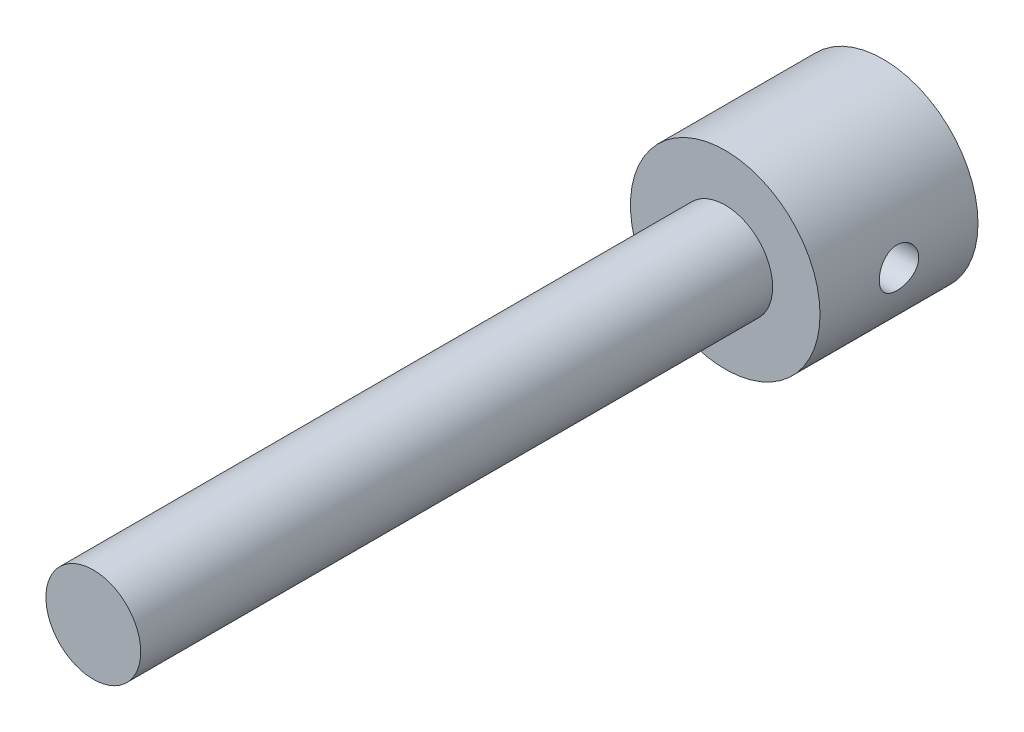
ISO-10303-21;
HEADER;
FILE_DESCRIPTION(('STEP AP214'),'2;1');
FILE_NAME('part.step','',(''),(''),'','','');
FILE_SCHEMA(('AUTOMOTIVE_DESIGN { 1 0 10303 214 1 1 1 1 }'));
ENDSEC;
DATA;
#1=APPLICATION_CONTEXT('core data for automotive mechanical design processes');
#2=APPLICATION_PROTOCOL_DEFINITION('international standard','automotive_design',2000,#1);
#3=PRODUCT_CONTEXT('',#1,'mechanical');
#4=PRODUCT('Part','Part','',(#3));
#5=PRODUCT_RELATED_PRODUCT_CATEGORY('part','',(#4));
#6=PRODUCT_DEFINITION_FORMATION('','',#4);
#7=PRODUCT_DEFINITION_CONTEXT('part definition',#1,'design');
#8=PRODUCT_DEFINITION('design','',#6,#7);
#9=PRODUCT_DEFINITION_SHAPE('','',#8);
#10=(LENGTH_UNIT() NAMED_UNIT(*) SI_UNIT(.MILLI.,.METRE.));
#11=(NAMED_UNIT(*) PLANE_ANGLE_UNIT() SI_UNIT($,.RADIAN.));
#12=(NAMED_UNIT(*) SI_UNIT($,.STERADIAN.) SOLID_ANGLE_UNIT());
#13=UNCERTAINTY_MEASURE_WITH_UNIT(LENGTH_MEASURE(1.E-05),#10,'distance_accuracy_value','');
#14=(GEOMETRIC_REPRESENTATION_CONTEXT(3) GLOBAL_UNCERTAINTY_ASSIGNED_CONTEXT((#13)) GLOBAL_UNIT_ASSIGNED_CONTEXT((#10,
#11,#12)) REPRESENTATION_CONTEXT('',''));
#15=CARTESIAN_POINT('',(0.,0.,0.));
#16=DIRECTION('',(0.,0.,1.));
#17=DIRECTION('',(1.,0.,0.));
#18=AXIS2_PLACEMENT_3D('',#15,#16,#17);
#19=CARTESIAN_POINT('',(0.,0.,20.));
#20=DIRECTION('',(0.,0.,-1.));
#21=DIRECTION('',(-1.,0.,0.));
#22=AXIS2_PLACEMENT_3D('',#19,#20,#21);
#23=CYLINDRICAL_SURFACE('',#22,12.);
#24=CARTESIAN_POINT('',(-12.,0.,12.5));
#25=CARTESIAN_POINT('',(-11.999997430533,-0.138818083403321,12.4999950450616));
#26=CARTESIAN_POINT('',(-11.9975665755009,-0.277697579041751,12.4883986685625));
#27=CARTESIAN_POINT('',(-11.9881040198136,-0.551522632533986,12.4423613009343));
#28=CARTESIAN_POINT('',(-11.981068823785,-0.686465120256625,12.4079029539261));
#29=CARTESIAN_POINT('',(-11.963182183924,-0.948418264582684,12.3172590901564));
#30=CARTESIAN_POINT('',(-11.9523345410529,-1.07543667341837,12.2610952080022));
#31=CARTESIAN_POINT('',(-11.9279985561972,-1.31824065721192,12.1287007822876));
#32=CARTESIAN_POINT('',(-11.9145103325195,-1.43402673506865,12.0524711376883));
#33=CARTESIAN_POINT('',(-11.886154000493,-1.65278064861767,11.8809273196187));
#34=CARTESIAN_POINT('',(-11.8712701169706,-1.75556048832537,11.7853759975298));
#35=CARTESIAN_POINT('',(-11.841913153849,-1.94375555353879,11.5784106816098));
#36=CARTESIAN_POINT('',(-11.8274401083337,-2.02916934192198,11.4669953762555));
#37=CARTESIAN_POINT('',(-11.8003888519062,-2.18102063354434,11.2300960624677));
#38=CARTESIAN_POINT('',(-11.7878309034966,-2.24726109361302,11.1044832309945));
#39=CARTESIAN_POINT('',(-11.7662568130004,-2.35762238696128,10.8436050964545));
#40=CARTESIAN_POINT('',(-11.7572402893514,-2.40174560335283,10.7083408351149));
#41=CARTESIAN_POINT('',(-11.7439300197224,-2.46600480267474,10.4340295251687));
#42=CARTESIAN_POINT('',(-11.7395711371173,-2.48647195393598,10.2950632813305));
#43=CARTESIAN_POINT('',(-11.7358738143298,-2.50386715311229,10.0156063142747));
#44=CARTESIAN_POINT('',(-11.7365348160196,-2.50079781789374,9.87511576226941));
#45=CARTESIAN_POINT('',(-11.7427434863835,-2.47147438074394,9.59903794404965));
#46=CARTESIAN_POINT('',(-11.748210673598,-2.44560210465441,9.46340804067757));
#47=CARTESIAN_POINT('',(-11.7632887523188,-2.3720108705989,9.19845698071014));
#48=CARTESIAN_POINT('',(-11.7728998568263,-2.32429078962764,9.06913614878733));
#49=CARTESIAN_POINT('',(-11.795263829282,-2.20800006427857,8.81938554316804));
#50=CARTESIAN_POINT('',(-11.8080390757117,-2.13928005068474,8.69902740694585));
#51=CARTESIAN_POINT('',(-11.8352778002144,-1.98304539854964,8.47140851146368));
#52=CARTESIAN_POINT('',(-11.8497414879707,-1.89552842452518,8.36414938232805));
#53=CARTESIAN_POINT('',(-11.8790746185982,-1.70214984309357,8.16357207783926));
#54=CARTESIAN_POINT('',(-11.8939464639895,-1.59596286682417,8.07056766220597));
#55=CARTESIAN_POINT('',(-11.92216176286,-1.3693345772236,7.90363911554205));
#56=CARTESIAN_POINT('',(-11.9355051934047,-1.24889305005153,7.82971527080321));
#57=CARTESIAN_POINT('',(-11.9591974188563,-0.996811082470957,7.70297983692809));
#58=CARTESIAN_POINT('',(-11.9695407942052,-0.865150923853,7.65020639086576));
#59=CARTESIAN_POINT('',(-11.9860267642256,-0.59456924194431,7.56761659032901));
#60=CARTESIAN_POINT('',(-11.9921699119211,-0.455648677190179,7.5377972135372));
#61=CARTESIAN_POINT('',(-11.9994855043091,-0.17718373140167,7.50241149586423));
#62=CARTESIAN_POINT('',(-12.0007458707516,-0.0376961110523567,7.4964161170115));
#63=CARTESIAN_POINT('',(-11.9983990450555,0.240287597515429,7.5076898999382));
#64=CARTESIAN_POINT('',(-11.9947921509631,0.378783745924516,7.5249576372032));
#65=CARTESIAN_POINT('',(-11.9831712995837,0.649452734239627,7.58191130693907));
#66=CARTESIAN_POINT('',(-11.9752010573615,0.781674385788413,7.62137497076693));
#67=CARTESIAN_POINT('',(-11.9557445448479,1.03762289332266,7.72135572084282));
#68=CARTESIAN_POINT('',(-11.9442579948916,1.16134907267355,7.78187448173196));
#69=CARTESIAN_POINT('',(-11.9188248298143,1.39858861388699,7.92316075647512));
#70=CARTESIAN_POINT('',(-11.9048478762466,1.51194643893967,8.00418385913812));
#71=CARTESIAN_POINT('',(-11.8760513659942,1.72361089177304,8.18383912615254));
#72=CARTESIAN_POINT('',(-11.8612317108502,1.82191575582657,8.28247335103788));
#73=CARTESIAN_POINT('',(-11.8321204906275,2.0023572973036,8.4965111539994));
#74=CARTESIAN_POINT('',(-11.81784178615,2.08419829200409,8.61216606391056));
#75=CARTESIAN_POINT('',(-11.7917120203161,2.22729438158487,8.85583256842757));
#76=CARTESIAN_POINT('',(-11.779860857893,2.28855033355728,8.98384364827821));
#77=CARTESIAN_POINT('',(-11.7600340141608,2.38834492887844,9.24792239259646));
#78=CARTESIAN_POINT('',(-11.7520374556937,2.42700619656063,9.38394207433167));
#79=CARTESIAN_POINT('',(-11.7407836941939,2.48088077046815,9.66073310098452));
#80=CARTESIAN_POINT('',(-11.7375258132073,2.49609743088882,9.80150376323888));
#81=CARTESIAN_POINT('',(-11.7361581461701,2.50251852975223,10.0808268019993));
#82=CARTESIAN_POINT('',(-11.73794804643,2.49419085245451,10.2193681404441));
#83=CARTESIAN_POINT('',(-11.7462489450985,2.45479810628063,10.4930280178404));
#84=CARTESIAN_POINT('',(-11.7527598981925,2.42373325564532,10.6281465896322));
#85=CARTESIAN_POINT('',(-11.7697226489543,2.3399643553717,10.8907955437813));
#86=CARTESIAN_POINT('',(-11.7801631401586,2.28732235136843,11.0183464929739));
#87=CARTESIAN_POINT('',(-11.8038141147748,2.16194914599515,11.2628775520533));
#88=CARTESIAN_POINT('',(-11.8170248553092,2.0892160796606,11.3798566792663));
#89=CARTESIAN_POINT('',(-11.8450315910229,1.92414739068482,11.6022432541589));
#90=CARTESIAN_POINT('',(-11.8598522773681,1.83147578083645,11.70739824913));
#91=CARTESIAN_POINT('',(-11.8892367916642,1.62984887623067,11.9008189864527));
#92=CARTESIAN_POINT('',(-11.9038005596976,1.52088983766594,11.989080835103));
#93=CARTESIAN_POINT('',(-11.9312288909527,1.28826885501541,12.1471771463681));
#94=CARTESIAN_POINT('',(-11.9440719214649,1.1644518430427,12.2167873597726));
#95=CARTESIAN_POINT('',(-11.9663981698818,0.906639687996907,12.33410045686));
#96=CARTESIAN_POINT('',(-11.975884323642,0.772653563814487,12.3818224943638));
#97=CARTESIAN_POINT('',(-11.9886499956289,0.53203058580021,12.4450805565768));
#98=CARTESIAN_POINT('',(-11.9928807132279,0.426735187455857,12.4656375264177));
#99=CARTESIAN_POINT('',(-11.9985566557952,0.214305348353073,12.4930989085547));
#100=CARTESIAN_POINT('',(-12.0000019836917,0.107170975697743,12.5000038253344));
#101=CARTESIAN_POINT('',(-12.,0.,12.5));
#102=B_SPLINE_CURVE_WITH_KNOTS('',3,(#24,#25,#26,#27,#28,#29,#30,#31,#32,#33,#34,#35,#36,#37,
#38,#39,#40,#41,#42,#43,#44,#45,#46,#47,#48,#49,#50,#51,#52,#53,#54,#55,#56,#57,#58,#59,#60,#61,
#62,#63,#64,#65,#66,#67,#68,#69,#70,#71,#72,#73,#74,#75,#76,#77,#78,#79,#80,#81,#82,#83,#84,#85,
#86,#87,#88,#89,#90,#91,#92,#93,#94,#95,#96,#97,#98,#99,#100,#101),.UNSPECIFIED.,.T.,.F.,(4,2,2,
2,2,2,2,2,2,2,2,2,2,2,2,2,2,2,2,2,2,2,2,2,2,2,2,2,2,2,2,2,2,2,2,2,2,2,4),(0.,0.416062090206366,
0.83244039981245,1.24840475765088,1.66435048314598,2.08575052776245,2.50718543103572,
2.93280898357097,3.35838666570981,3.77793150339709,4.19742969534329,4.61003424258119,
5.0226600006056,5.43829184833498,5.85397536736069,6.27779052710932,6.70161204556436,
7.12619448999325,7.55072102091543,7.96756678815351,8.38438703104555,8.79710573265244,
9.20985726781867,9.62803167991474,10.0462550512915,10.4714252765867,10.8965777970262,
11.3194010019005,11.7421637082837,12.1565844658208,12.5710012456272,12.9842346278651,
13.3975063816296,13.8183804966062,14.2393515023474,14.6651772879651,15.0906297292995,
15.4118517695456,15.7330619394678),.UNSPECIFIED.);
#103=CARTESIAN_POINT('',(-12.,0.,12.5));
#104=VERTEX_POINT('',#103);
#105=EDGE_CURVE('E53',#104,#104,#102,.T.);
#106=ORIENTED_EDGE('',*,*,#105,.T.);
#107=EDGE_LOOP('',(#106));
#108=FACE_BOUND('',#107,.T.);
#109=CARTESIAN_POINT('',(12.,0.,7.5));
#110=CARTESIAN_POINT('',(11.999997430533,-0.138818083403321,7.50000495493845));
#111=CARTESIAN_POINT('',(11.9975665755009,-0.277697579041751,7.5116013314375));
#112=CARTESIAN_POINT('',(11.9881040198136,-0.551522632533987,7.5576386990657));
#113=CARTESIAN_POINT('',(11.981068823785,-0.686465120256626,7.59209704607386));
#114=CARTESIAN_POINT('',(11.963182183924,-0.948418264582684,7.68274090984364));
#115=CARTESIAN_POINT('',(11.9523345410529,-1.07543667341837,7.73890479199777));
#116=CARTESIAN_POINT('',(11.9279985561972,-1.31824065721192,7.87129921771236));
#117=CARTESIAN_POINT('',(11.9145103325195,-1.43402673506865,7.94752886231166));
#118=CARTESIAN_POINT('',(11.886154000493,-1.65278064861767,8.11907268038129));
#119=CARTESIAN_POINT('',(11.8712701169706,-1.75556048832537,8.21462400247016));
#120=CARTESIAN_POINT('',(11.841913153849,-1.94375555353879,8.42158931839022));
#121=CARTESIAN_POINT('',(11.8274401083337,-2.02916934192198,8.53300462374453));
#122=CARTESIAN_POINT('',(11.8003888519062,-2.18102063354434,8.76990393753232));
#123=CARTESIAN_POINT('',(11.7878309034966,-2.24726109361302,8.89551676900549));
#124=CARTESIAN_POINT('',(11.7662568130004,-2.35762238696128,9.15639490354551));
#125=CARTESIAN_POINT('',(11.7572402893514,-2.40174560335283,9.29165916488507));
#126=CARTESIAN_POINT('',(11.7439300197224,-2.46600480267474,9.56597047483128));
#127=CARTESIAN_POINT('',(11.7395711371173,-2.48647195393598,9.70493671866953));
#128=CARTESIAN_POINT('',(11.7358738143298,-2.50386715311229,9.98439368572527));
#129=CARTESIAN_POINT('',(11.7365348160196,-2.50079781789374,10.1248842377306));
#130=CARTESIAN_POINT('',(11.7427434863835,-2.47147438074394,10.4009620559504));
#131=CARTESIAN_POINT('',(11.748210673598,-2.44560210465441,10.5365919593224));
#132=CARTESIAN_POINT('',(11.7632887523188,-2.3720108705989,10.8015430192899));
#133=CARTESIAN_POINT('',(11.7728998568263,-2.32429078962764,10.9308638512127));
#134=CARTESIAN_POINT('',(11.795263829282,-2.20800006427857,11.180614456832));
#135=CARTESIAN_POINT('',(11.8080390757117,-2.13928005068474,11.3009725930541));
#136=CARTESIAN_POINT('',(11.8352778002144,-1.98304539854964,11.5285914885363));
#137=CARTESIAN_POINT('',(11.8497414879707,-1.89552842452518,11.635850617672));
#138=CARTESIAN_POINT('',(11.8790746185982,-1.70214984309357,11.8364279221607));
#139=CARTESIAN_POINT('',(11.8939464639895,-1.59596286682417,11.929432337794));
#140=CARTESIAN_POINT('',(11.92216176286,-1.3693345772236,12.0963608844579));
#141=CARTESIAN_POINT('',(11.9355051934047,-1.24889305005153,12.1702847291968));
#142=CARTESIAN_POINT('',(11.9591974188563,-0.996811082470956,12.2970201630719));
#143=CARTESIAN_POINT('',(11.9695407942052,-0.865150923852999,12.3497936091342));
#144=CARTESIAN_POINT('',(11.9860267642256,-0.594569241944309,12.432383409671));
#145=CARTESIAN_POINT('',(11.9921699119211,-0.455648677190178,12.4622027864628));
#146=CARTESIAN_POINT('',(11.9994855043091,-0.177183731401669,12.4975885041358));
#147=CARTESIAN_POINT('',(12.0007458707516,-0.0376961110523559,12.5035838829885));
#148=CARTESIAN_POINT('',(11.9983990450555,0.24028759751543,12.4923101000618));
#149=CARTESIAN_POINT('',(11.9947921509631,0.378783745924517,12.4750423627968));
#150=CARTESIAN_POINT('',(11.9831712995837,0.649452734239627,12.4180886930609));
#151=CARTESIAN_POINT('',(11.9752010573615,0.781674385788412,12.3786250292331));
#152=CARTESIAN_POINT('',(11.9557445448479,1.03762289332266,12.2786442791572));
#153=CARTESIAN_POINT('',(11.9442579948916,1.16134907267355,12.218125518268));
#154=CARTESIAN_POINT('',(11.9188248298143,1.39858861388699,12.0768392435249));
#155=CARTESIAN_POINT('',(11.9048478762466,1.51194643893967,11.9958161408619));
#156=CARTESIAN_POINT('',(11.8760513659942,1.72361089177304,11.8161608738475));
#157=CARTESIAN_POINT('',(11.8612317108502,1.82191575582657,11.7175266489621));
#158=CARTESIAN_POINT('',(11.8321204906275,2.0023572973036,11.5034888460006));
#159=CARTESIAN_POINT('',(11.81784178615,2.08419829200409,11.3878339360894));
#160=CARTESIAN_POINT('',(11.7917120203161,2.22729438158487,11.1441674315724));
#161=CARTESIAN_POINT('',(11.779860857893,2.28855033355728,11.0161563517218));
#162=CARTESIAN_POINT('',(11.7600340141608,2.38834492887844,10.7520776074035));
#163=CARTESIAN_POINT('',(11.7520374556937,2.42700619656063,10.6160579256683));
#164=CARTESIAN_POINT('',(11.7407836941939,2.48088077046815,10.3392668990155));
#165=CARTESIAN_POINT('',(11.7375258132073,2.49609743088882,10.1984962367611));
#166=CARTESIAN_POINT('',(11.7361581461701,2.50251852975223,9.91917319800071));
#167=CARTESIAN_POINT('',(11.73794804643,2.49419085245451,9.78063185955589));
#168=CARTESIAN_POINT('',(11.7462489450985,2.45479810628063,9.50697198215956));
#169=CARTESIAN_POINT('',(11.7527598981925,2.42373325564532,9.37185341036779));
#170=CARTESIAN_POINT('',(11.7697226489543,2.3399643553717,9.10920445621868));
#171=CARTESIAN_POINT('',(11.7801631401586,2.28732235136843,8.98165350702615));
#172=CARTESIAN_POINT('',(11.8038141147748,2.16194914599515,8.73712244794667));
#173=CARTESIAN_POINT('',(11.8170248553092,2.0892160796606,8.62014332073375));
#174=CARTESIAN_POINT('',(11.8450315910229,1.92414739068482,8.39775674584111));
#175=CARTESIAN_POINT('',(11.8598522773681,1.83147578083645,8.29260175087003));
#176=CARTESIAN_POINT('',(11.8892367916642,1.62984887623067,8.09918101354728));
#177=CARTESIAN_POINT('',(11.9038005596976,1.52088983766594,8.01091916489703));
#178=CARTESIAN_POINT('',(11.9312288909527,1.28826885501541,7.85282285363188));
#179=CARTESIAN_POINT('',(11.9440719214649,1.1644518430427,7.78321264022743));
#180=CARTESIAN_POINT('',(11.9663981698818,0.906639687996909,7.66589954313995));
#181=CARTESIAN_POINT('',(11.975884323642,0.772653563814489,7.61817750563625));
#182=CARTESIAN_POINT('',(11.9886499956289,0.532030585800211,7.55491944342315));
#183=CARTESIAN_POINT('',(11.9928807132279,0.426735187455858,7.53436247358229));
#184=CARTESIAN_POINT('',(11.9985566557952,0.214305348353074,7.50690109144534));
#185=CARTESIAN_POINT('',(12.0000019836917,0.107170975697744,7.49999617466561));
#186=CARTESIAN_POINT('',(12.,0.,7.5));
#187=B_SPLINE_CURVE_WITH_KNOTS('',3,(#109,#110,#111,#112,#113,#114,#115,#116,#117,#118,#119,
#120,#121,#122,#123,#124,#125,#126,#127,#128,#129,#130,#131,#132,#133,#134,#135,#136,#137,#138,
#139,#140,#141,#142,#143,#144,#145,#146,#147,#148,#149,#150,#151,#152,#153,#154,#155,#156,#157,
#158,#159,#160,#161,#162,#163,#164,#165,#166,#167,#168,#169,#170,#171,#172,#173,#174,#175,#176,
#177,#178,#179,#180,#181,#182,#183,#184,#185,#186),.UNSPECIFIED.,.T.,.F.,(4,2,2,2,2,2,2,2,2,2,2,
2,2,2,2,2,2,2,2,2,2,2,2,2,2,2,2,2,2,2,2,2,2,2,2,2,2,2,4),(0.,0.416062090206367,0.83244039981245,
1.24840475765089,1.66435048314598,2.08575052776245,2.50718543103572,2.93280898357097,
3.35838666570981,3.77793150339709,4.19742969534329,4.61003424258119,5.0226600006056,
5.43829184833498,5.85397536736069,6.27779052710932,6.70161204556436,7.12619448999325,
7.55072102091543,7.96756678815352,8.38438703104556,8.79710573265243,9.20985726781867,
9.62803167991474,10.0462550512915,10.4714252765867,10.8965777970262,11.3194010019005,
11.7421637082837,12.1565844658208,12.5710012456272,12.9842346278651,13.3975063816296,
13.8183804966062,14.2393515023474,14.6651772879651,15.0906297292995,15.4118517695456,
15.7330619394678),.UNSPECIFIED.);
#188=CARTESIAN_POINT('',(12.,0.,7.5));
#189=VERTEX_POINT('',#188);
#190=EDGE_CURVE('E72',#189,#189,#187,.T.);
#191=ORIENTED_EDGE('',*,*,#190,.T.);
#192=EDGE_LOOP('',(#191));
#193=FACE_BOUND('',#192,.T.);
#194=CARTESIAN_POINT('',(0.,0.,20.));
#195=DIRECTION('',(0.,0.,1.));
#196=DIRECTION('',(1.,0.,0.));
#197=AXIS2_PLACEMENT_3D('',#194,#195,#196);
#198=CIRCLE('',#197,12.);
#199=CARTESIAN_POINT('',(12.,0.,20.));
#200=VERTEX_POINT('',#199);
#201=EDGE_CURVE('E61',#200,#200,#198,.T.);
#202=ORIENTED_EDGE('',*,*,#201,.F.);
#203=EDGE_LOOP('',(#202));
#204=FACE_BOUND('',#203,.T.);
#205=CARTESIAN_POINT('',(0.,0.,0.));
#206=DIRECTION('',(0.,0.,1.));
#207=DIRECTION('',(1.,0.,0.));
#208=AXIS2_PLACEMENT_3D('',#205,#206,#207);
#209=CIRCLE('',#208,12.);
#210=CARTESIAN_POINT('',(12.,0.,0.));
#211=VERTEX_POINT('',#210);
#212=EDGE_CURVE('E66',#211,#211,#209,.T.);
#213=ORIENTED_EDGE('',*,*,#212,.T.);
#214=EDGE_LOOP('',(#213));
#215=FACE_BOUND('',#214,.T.);
#216=ADVANCED_FACE('F49',(#108,#193,#204,#215),#23,.T.);
#217=CARTESIAN_POINT('',(0.,0.,20.));
#218=DIRECTION('',(0.,0.,1.));
#219=DIRECTION('',(1.,0.,0.));
#220=AXIS2_PLACEMENT_3D('',#217,#218,#219);
#221=PLANE('',#220);
#222=CARTESIAN_POINT('',(0.,0.,20.));
#223=DIRECTION('',(0.,0.,1.));
#224=DIRECTION('',(1.,0.,0.));
#225=AXIS2_PLACEMENT_3D('',#222,#223,#224);
#226=CIRCLE('',#225,6.);
#227=CARTESIAN_POINT('',(6.,0.,20.));
#228=VERTEX_POINT('',#227);
#229=EDGE_CURVE('E10',#228,#228,#226,.T.);
#230=ORIENTED_EDGE('',*,*,#229,.F.);
#231=EDGE_LOOP('',(#230));
#232=FACE_BOUND('',#231,.T.);
#233=ORIENTED_EDGE('',*,*,#201,.T.);
#234=EDGE_LOOP('',(#233));
#235=FACE_BOUND('',#234,.T.);
#236=ADVANCED_FACE('F92',(#232,#235),#221,.T.);
#237=CARTESIAN_POINT('',(0.,0.,0.));
#238=DIRECTION('',(0.,0.,1.));
#239=DIRECTION('',(1.,0.,0.));
#240=AXIS2_PLACEMENT_3D('',#237,#238,#239);
#241=PLANE('',#240);
#242=ORIENTED_EDGE('',*,*,#212,.F.);
#243=EDGE_LOOP('',(#242));
#244=FACE_BOUND('',#243,.T.);
#245=ADVANCED_FACE('F90',(#244),#241,.F.);
#246=CARTESIAN_POINT('',(0.,0.,100.));
#247=DIRECTION('',(0.,0.,-1.));
#248=DIRECTION('',(-1.,0.,0.));
#249=AXIS2_PLACEMENT_3D('',#246,#247,#248);
#250=CYLINDRICAL_SURFACE('',#249,6.);
#251=CARTESIAN_POINT('',(0.,0.,100.));
#252=DIRECTION('',(0.,0.,1.));
#253=DIRECTION('',(1.,0.,0.));
#254=AXIS2_PLACEMENT_3D('',#251,#252,#253);
#255=CIRCLE('',#254,6.);
#256=CARTESIAN_POINT('',(6.,0.,100.));
#257=VERTEX_POINT('',#256);
#258=EDGE_CURVE('E69',#257,#257,#255,.T.);
#259=ORIENTED_EDGE('',*,*,#258,.F.);
#260=EDGE_LOOP('',(#259));
#261=FACE_BOUND('',#260,.T.);
#262=ORIENTED_EDGE('',*,*,#229,.T.);
#263=EDGE_LOOP('',(#262));
#264=FACE_BOUND('',#263,.T.);
#265=ADVANCED_FACE('F86',(#261,#264),#250,.T.);
#266=CARTESIAN_POINT('',(0.,0.,100.));
#267=DIRECTION('',(0.,0.,1.));
#268=DIRECTION('',(1.,0.,0.));
#269=AXIS2_PLACEMENT_3D('',#266,#267,#268);
#270=PLANE('',#269);
#271=ORIENTED_EDGE('',*,*,#258,.T.);
#272=EDGE_LOOP('',(#271));
#273=FACE_BOUND('',#272,.T.);
#274=ADVANCED_FACE('F81',(#273),#270,.T.);
#275=CARTESIAN_POINT('',(-40.,0.,10.));
#276=DIRECTION('',(1.,0.,0.));
#277=DIRECTION('',(0.,0.,-1.));
#278=AXIS2_PLACEMENT_3D('',#275,#276,#277);
#279=CYLINDRICAL_SURFACE('',#278,2.5);
#280=ORIENTED_EDGE('',*,*,#190,.F.);
#281=EDGE_LOOP('',(#280));
#282=FACE_BOUND('',#281,.T.);
#283=ORIENTED_EDGE('',*,*,#105,.F.);
#284=EDGE_LOOP('',(#283));
#285=FACE_BOUND('',#284,.T.);
#286=ADVANCED_FACE('F77',(#282,#285),#279,.F.);
#287=CLOSED_SHELL('',(#216,#236,#245,#265,#274,#286));
#288=MANIFOLD_SOLID_BREP('B2',#287);
#289=ADVANCED_BREP_SHAPE_REPRESENTATION('',(#18,#288),#14);
#290=SHAPE_DEFINITION_REPRESENTATION(#9,#289);
ENDSEC;
END-ISO-10303-21;
